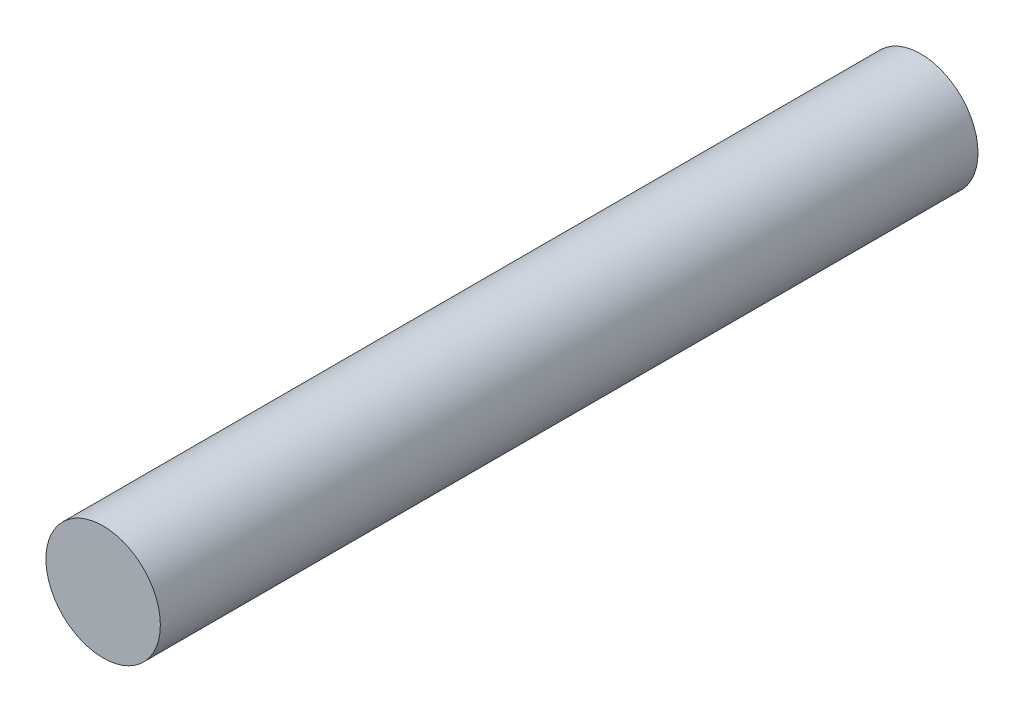
ISO-10303-21;
HEADER;
FILE_DESCRIPTION(('STEP AP214'),'2;1');
FILE_NAME('part.step','',(''),(''),'','','');
FILE_SCHEMA(('AUTOMOTIVE_DESIGN { 1 0 10303 214 1 1 1 1 }'));
ENDSEC;
DATA;
#1=APPLICATION_CONTEXT('core data for automotive mechanical design processes');
#2=APPLICATION_PROTOCOL_DEFINITION('international standard','automotive_design',2000,#1);
#3=PRODUCT_CONTEXT('',#1,'mechanical');
#4=PRODUCT('Part','Part','',(#3));
#5=PRODUCT_RELATED_PRODUCT_CATEGORY('part','',(#4));
#6=PRODUCT_DEFINITION_FORMATION('','',#4);
#7=PRODUCT_DEFINITION_CONTEXT('part definition',#1,'design');
#8=PRODUCT_DEFINITION('design','',#6,#7);
#9=PRODUCT_DEFINITION_SHAPE('','',#8);
#10=(LENGTH_UNIT() NAMED_UNIT(*) SI_UNIT(.MILLI.,.METRE.));
#11=(NAMED_UNIT(*) PLANE_ANGLE_UNIT() SI_UNIT($,.RADIAN.));
#12=(NAMED_UNIT(*) SI_UNIT($,.STERADIAN.) SOLID_ANGLE_UNIT());
#13=UNCERTAINTY_MEASURE_WITH_UNIT(LENGTH_MEASURE(1.E-05),#10,'distance_accuracy_value','');
#14=(GEOMETRIC_REPRESENTATION_CONTEXT(3) GLOBAL_UNCERTAINTY_ASSIGNED_CONTEXT((#13)) GLOBAL_UNIT_ASSIGNED_CONTEXT((#10,
#11,#12)) REPRESENTATION_CONTEXT('',''));
#15=CARTESIAN_POINT('',(0.,0.,0.));
#16=DIRECTION('',(0.,0.,1.));
#17=DIRECTION('',(1.,0.,0.));
#18=AXIS2_PLACEMENT_3D('',#15,#16,#17);
#19=CARTESIAN_POINT('',(0.,0.,100.));
#20=DIRECTION('',(0.,0.,-1.));
#21=DIRECTION('',(-1.,0.,0.));
#22=AXIS2_PLACEMENT_3D('',#19,#20,#21);
#23=CYLINDRICAL_SURFACE('',#22,7.);
#24=CARTESIAN_POINT('',(0.,0.,100.));
#25=DIRECTION('',(0.,0.,1.));
#26=DIRECTION('',(1.,0.,0.));
#27=AXIS2_PLACEMENT_3D('',#24,#25,#26);
#28=CIRCLE('',#27,7.);
#29=CARTESIAN_POINT('',(7.,0.,100.));
#30=VERTEX_POINT('',#29);
#31=EDGE_CURVE('E12',#30,#30,#28,.T.);
#32=ORIENTED_EDGE('',*,*,#31,.F.);
#33=EDGE_LOOP('',(#32));
#34=FACE_BOUND('',#33,.T.);
#35=CARTESIAN_POINT('',(0.,0.,0.));
#36=DIRECTION('',(0.,0.,1.));
#37=DIRECTION('',(1.,0.,0.));
#38=AXIS2_PLACEMENT_3D('',#35,#36,#37);
#39=CIRCLE('',#38,7.);
#40=CARTESIAN_POINT('',(7.,0.,0.));
#41=VERTEX_POINT('',#40);
#42=EDGE_CURVE('E44',#41,#41,#39,.T.);
#43=ORIENTED_EDGE('',*,*,#42,.T.);
#44=EDGE_LOOP('',(#43));
#45=FACE_BOUND('',#44,.T.);
#46=ADVANCED_FACE('F41',(#34,#45),#23,.T.);
#47=CARTESIAN_POINT('',(0.,0.,100.));
#48=DIRECTION('',(0.,0.,1.));
#49=DIRECTION('',(1.,0.,0.));
#50=AXIS2_PLACEMENT_3D('',#47,#48,#49);
#51=PLANE('',#50);
#52=ORIENTED_EDGE('',*,*,#31,.T.);
#53=EDGE_LOOP('',(#52));
#54=FACE_BOUND('',#53,.T.);
#55=ADVANCED_FACE('F56',(#54),#51,.T.);
#56=CARTESIAN_POINT('',(0.,0.,0.));
#57=DIRECTION('',(0.,0.,1.));
#58=DIRECTION('',(1.,0.,0.));
#59=AXIS2_PLACEMENT_3D('',#56,#57,#58);
#60=PLANE('',#59);
#61=ORIENTED_EDGE('',*,*,#42,.F.);
#62=EDGE_LOOP('',(#61));
#63=FACE_BOUND('',#62,.T.);
#64=ADVANCED_FACE('F54',(#63),#60,.F.);
#65=CLOSED_SHELL('',(#46,#55,#64));
#66=MANIFOLD_SOLID_BREP('B2',#65);
#67=ADVANCED_BREP_SHAPE_REPRESENTATION('',(#18,#66),#14);
#68=SHAPE_DEFINITION_REPRESENTATION(#9,#67);
ENDSEC;
END-ISO-10303-21;
